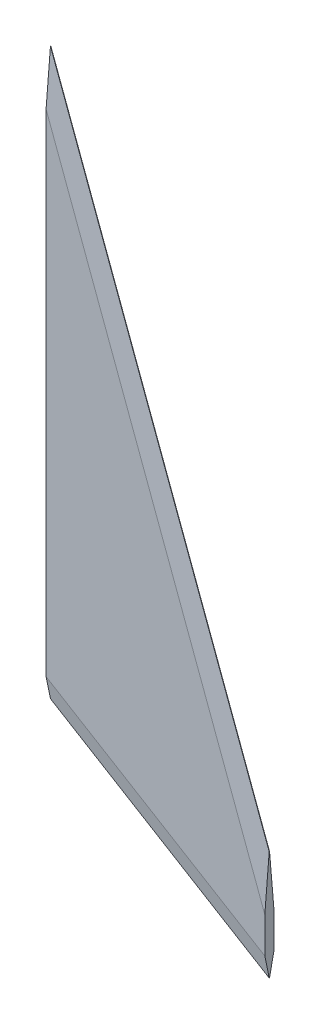
ISO-10303-21;
HEADER;
FILE_DESCRIPTION(('STEP AP214'),'2;1');
FILE_NAME('part.step','',(''),(''),'','','');
FILE_SCHEMA(('AUTOMOTIVE_DESIGN { 1 0 10303 214 1 1 1 1 }'));
ENDSEC;
DATA;
#1=APPLICATION_CONTEXT('core data for automotive mechanical design processes');
#2=APPLICATION_PROTOCOL_DEFINITION('international standard','automotive_design',2000,#1);
#3=PRODUCT_CONTEXT('',#1,'mechanical');
#4=PRODUCT('Part','Part','',(#3));
#5=PRODUCT_RELATED_PRODUCT_CATEGORY('part','',(#4));
#6=PRODUCT_DEFINITION_FORMATION('','',#4);
#7=PRODUCT_DEFINITION_CONTEXT('part definition',#1,'design');
#8=PRODUCT_DEFINITION('design','',#6,#7);
#9=PRODUCT_DEFINITION_SHAPE('','',#8);
#10=(LENGTH_UNIT() NAMED_UNIT(*) SI_UNIT(.MILLI.,.METRE.));
#11=(NAMED_UNIT(*) PLANE_ANGLE_UNIT() SI_UNIT($,.RADIAN.));
#12=(NAMED_UNIT(*) SI_UNIT($,.STERADIAN.) SOLID_ANGLE_UNIT());
#13=UNCERTAINTY_MEASURE_WITH_UNIT(LENGTH_MEASURE(1.E-05),#10,'distance_accuracy_value','');
#14=(GEOMETRIC_REPRESENTATION_CONTEXT(3) GLOBAL_UNCERTAINTY_ASSIGNED_CONTEXT((#13)) GLOBAL_UNIT_ASSIGNED_CONTEXT((#10,
#11,#12)) REPRESENTATION_CONTEXT('',''));
#15=CARTESIAN_POINT('',(0.,0.,0.));
#16=DIRECTION('',(0.,0.,1.));
#17=DIRECTION('',(1.,0.,0.));
#18=AXIS2_PLACEMENT_3D('',#15,#16,#17);
#19=CARTESIAN_POINT('',(152.414038873501,-92.3290000000001,6.35));
#20=DIRECTION('',(0.518124629895629,0.855305131456322,0.));
#21=DIRECTION('',(-0.855305131456322,0.518124629895629,0.));
#22=AXIS2_PLACEMENT_3D('',#19,#20,#21);
#23=PLANE('',#22);
#24=DIRECTION('',(0.,0.,-1.));
#25=VECTOR('',#24,1.);
#26=CARTESIAN_POINT('',(152.414038873501,-92.3290000000001,6.35));
#27=LINE('',#26,#25);
#28=CARTESIAN_POINT('',(152.414038873501,-92.3290000000001,3.30199999999997));
#29=VERTEX_POINT('',#28);
#30=CARTESIAN_POINT('',(152.414038873501,-92.3290000000001,3.04800000000002));
#31=VERTEX_POINT('',#30);
#32=EDGE_CURVE('E129',#29,#31,#27,.T.);
#33=ORIENTED_EDGE('',*,*,#32,.F.);
#34=DIRECTION('',(-0.855305131456322,0.518124629895629,0.));
#35=VECTOR('',#34,1.);
#36=CARTESIAN_POINT('',(152.414038873501,-92.3290000000001,3.30199999999997));
#37=LINE('',#36,#35);
#38=CARTESIAN_POINT('',(0.,0.,3.30199999999997));
#39=VERTEX_POINT('',#38);
#40=EDGE_CURVE('E78',#29,#39,#37,.T.);
#41=ORIENTED_EDGE('',*,*,#40,.T.);
#42=DIRECTION('',(0.,0.,-1.));
#43=VECTOR('',#42,1.);
#44=CARTESIAN_POINT('',(0.,0.,6.35));
#45=LINE('',#44,#43);
#46=CARTESIAN_POINT('',(0.,0.,3.04800000000002));
#47=VERTEX_POINT('',#46);
#48=EDGE_CURVE('E152',#39,#47,#45,.T.);
#49=ORIENTED_EDGE('',*,*,#48,.T.);
#50=DIRECTION('',(0.855305131456322,-0.518124629895629,0.));
#51=VECTOR('',#50,1.);
#52=CARTESIAN_POINT('',(152.414038873501,-92.3290000000001,3.04800000000002));
#53=LINE('',#52,#51);
#54=EDGE_CURVE('E139',#47,#31,#53,.T.);
#55=ORIENTED_EDGE('',*,*,#54,.T.);
#56=EDGE_LOOP('',(#33,#41,#49,#55));
#57=FACE_BOUND('',#56,.T.);
#58=ADVANCED_FACE('F48',(#57),#23,.F.);
#59=CARTESIAN_POINT('',(152.414038873501,-16.1290000000001,6.35));
#60=DIRECTION('',(-1.,0.,0.));
#61=DIRECTION('',(0.,-1.,0.));
#62=AXIS2_PLACEMENT_3D('',#59,#60,#61);
#63=PLANE('',#62);
#64=DIRECTION('',(0.,1.,0.));
#65=VECTOR('',#64,1.);
#66=CARTESIAN_POINT('',(152.414038873501,-16.1290000000001,6.35));
#67=LINE('',#66,#65);
#68=CARTESIAN_POINT('',(152.414038873501,-77.4804979474331,6.35));
#69=VERTEX_POINT('',#68);
#70=CARTESIAN_POINT('',(152.414038873501,-52.5633615547442,6.35));
#71=VERTEX_POINT('',#70);
#72=EDGE_CURVE('E205',#69,#71,#67,.T.);
#73=ORIENTED_EDGE('',*,*,#72,.F.);
#74=DIRECTION('',(0.,0.979574726464062,0.20108046964551));
#75=VECTOR('',#74,1.);
#76=CARTESIAN_POINT('',(152.414038873501,7.29037639493369,23.7511913175355));
#77=LINE('',#76,#75);
#78=EDGE_CURVE('E136',#69,#29,#77,.F.);
#79=ORIENTED_EDGE('',*,*,#78,.T.);
#80=ORIENTED_EDGE('',*,*,#32,.T.);
#81=DIRECTION('',(0.,0.979574726464062,-0.20108046964551));
#82=VECTOR('',#81,1.);
#83=CARTESIAN_POINT('',(152.414038873501,-92.3290000000001,3.04800000000002));
#84=LINE('',#83,#82);
#85=CARTESIAN_POINT('',(152.414038873501,-77.4804979474331,0.));
#86=VERTEX_POINT('',#85);
#87=EDGE_CURVE('E134',#31,#86,#84,.T.);
#88=ORIENTED_EDGE('',*,*,#87,.T.);
#89=DIRECTION('',(0.,1.,0.));
#90=VECTOR('',#89,1.);
#91=CARTESIAN_POINT('',(152.414038873501,-16.1290000000001,0.));
#92=LINE('',#91,#90);
#93=CARTESIAN_POINT('',(152.414038873501,-52.5633615547441,0.));
#94=VERTEX_POINT('',#93);
#95=EDGE_CURVE('E270',#86,#94,#92,.T.);
#96=ORIENTED_EDGE('',*,*,#95,.T.);
#97=DIRECTION('',(0.,0.996518989681084,0.0833660794627664));
#98=VECTOR('',#97,1.);
#99=CARTESIAN_POINT('',(152.414038873501,390.851728119401,37.0949053490638));
#100=LINE('',#99,#98);
#101=CARTESIAN_POINT('',(152.414038873501,-16.1290000000001,3.04800000000002));
#102=VERTEX_POINT('',#101);
#103=EDGE_CURVE('E150',#94,#102,#100,.T.);
#104=ORIENTED_EDGE('',*,*,#103,.T.);
#105=DIRECTION('',(0.,0.,-1.));
#106=VECTOR('',#105,1.);
#107=CARTESIAN_POINT('',(152.414038873501,-16.1290000000001,6.35));
#108=LINE('',#107,#106);
#109=CARTESIAN_POINT('',(152.414038873501,-16.1290000000001,3.30199999999997));
#110=VERTEX_POINT('',#109);
#111=EDGE_CURVE('E140',#110,#102,#108,.T.);
#112=ORIENTED_EDGE('',*,*,#111,.F.);
#113=DIRECTION('',(0.,0.996518989681084,-0.0833660794627664));
#114=VECTOR('',#113,1.);
#115=CARTESIAN_POINT('',(152.414038873501,42.7416620456271,-1.62296012714428));
#116=LINE('',#115,#114);
#117=EDGE_CURVE('E183',#110,#71,#116,.F.);
#118=ORIENTED_EDGE('',*,*,#117,.T.);
#119=EDGE_LOOP('',(#73,#79,#80,#88,#96,#104,#112,#118));
#120=FACE_BOUND('',#119,.T.);
#121=ADVANCED_FACE('F132',(#120),#63,.F.);
#122=CARTESIAN_POINT('',(0.,393.7,6.35));
#123=DIRECTION('',(-0.937281989491893,-0.34857204732181,0.));
#124=DIRECTION('',(0.34857204732181,-0.937281989491894,0.));
#125=AXIS2_PLACEMENT_3D('',#122,#123,#124);
#126=PLANE('',#125);
#127=DIRECTION('',(0.,0.,-1.));
#128=VECTOR('',#127,1.);
#129=CARTESIAN_POINT('',(0.,393.7,6.35));
#130=LINE('',#129,#128);
#131=CARTESIAN_POINT('',(0.,393.7,3.30199999999997));
#132=VERTEX_POINT('',#131);
#133=CARTESIAN_POINT('',(0.,393.7,3.04800000000002));
#134=VERTEX_POINT('',#133);
#135=EDGE_CURVE('E257',#132,#134,#130,.T.);
#136=ORIENTED_EDGE('',*,*,#135,.F.);
#137=DIRECTION('',(0.34857204732181,-0.937281989491894,0.));
#138=VECTOR('',#137,1.);
#139=CARTESIAN_POINT('',(0.,393.7,3.30199999999997));
#140=LINE('',#139,#138);
#141=EDGE_CURVE('E11',#132,#110,#140,.T.);
#142=ORIENTED_EDGE('',*,*,#141,.T.);
#143=ORIENTED_EDGE('',*,*,#111,.T.);
#144=DIRECTION('',(-0.34857204732181,0.937281989491894,0.));
#145=VECTOR('',#144,1.);
#146=CARTESIAN_POINT('',(0.,393.7,3.04800000000002));
#147=LINE('',#146,#145);
#148=EDGE_CURVE('E171',#102,#134,#147,.T.);
#149=ORIENTED_EDGE('',*,*,#148,.T.);
#150=EDGE_LOOP('',(#136,#142,#143,#149));
#151=FACE_BOUND('',#150,.T.);
#152=ADVANCED_FACE('F225',(#151),#126,.F.);
#153=CARTESIAN_POINT('',(0.,0.,6.35));
#154=DIRECTION('',(1.,0.,0.));
#155=DIRECTION('',(0.,0.,-1.));
#156=AXIS2_PLACEMENT_3D('',#153,#154,#155);
#157=PLANE('',#156);
#158=ORIENTED_EDGE('',*,*,#48,.F.);
#159=DIRECTION('',(0.,-0.979574726464062,-0.20108046964551));
#160=VECTOR('',#159,1.);
#161=CARTESIAN_POINT('',(0.,11.0235476539214,5.5648392500605));
#162=LINE('',#161,#160);
#163=CARTESIAN_POINT('',(0.,14.8485020525669,6.35));
#164=VERTEX_POINT('',#163);
#165=EDGE_CURVE('E58',#39,#164,#162,.F.);
#166=ORIENTED_EDGE('',*,*,#165,.T.);
#167=DIRECTION('',(0.,-1.,0.));
#168=VECTOR('',#167,1.);
#169=CARTESIAN_POINT('',(0.,0.,6.35));
#170=LINE('',#169,#168);
#171=CARTESIAN_POINT('',(0.,357.265638445256,6.35));
#172=VERTEX_POINT('',#171);
#173=EDGE_CURVE('E197',#172,#164,#170,.T.);
#174=ORIENTED_EDGE('',*,*,#173,.F.);
#175=DIRECTION('',(0.,-0.996518989681084,0.0833660794627665));
#176=VECTOR('',#175,1.);
#177=CARTESIAN_POINT('',(0.,45.5899339262258,32.4239452219196));
#178=LINE('',#177,#176);
#179=EDGE_CURVE('E67',#172,#132,#178,.F.);
#180=ORIENTED_EDGE('',*,*,#179,.T.);
#181=ORIENTED_EDGE('',*,*,#135,.T.);
#182=DIRECTION('',(0.,-0.996518989681084,-0.0833660794627665));
#183=VECTOR('',#182,1.);
#184=CARTESIAN_POINT('',(0.,393.7,3.04800000000002));
#185=LINE('',#184,#183);
#186=CARTESIAN_POINT('',(0.,357.265638445256,0.));
#187=VERTEX_POINT('',#186);
#188=EDGE_CURVE('E165',#134,#187,#185,.T.);
#189=ORIENTED_EDGE('',*,*,#188,.T.);
#190=DIRECTION('',(0.,-1.,0.));
#191=VECTOR('',#190,1.);
#192=CARTESIAN_POINT('',(0.,0.,0.));
#193=LINE('',#192,#191);
#194=CARTESIAN_POINT('',(0.,14.848502052567,0.));
#195=VERTEX_POINT('',#194);
#196=EDGE_CURVE('E265',#187,#195,#193,.T.);
#197=ORIENTED_EDGE('',*,*,#196,.T.);
#198=DIRECTION('',(0.,-0.979574726464062,0.20108046964551));
#199=VECTOR('',#198,1.);
#200=CARTESIAN_POINT('',(0.,-88.5958287410123,21.234352067475));
#201=LINE('',#200,#199);
#202=EDGE_CURVE('E168',#195,#47,#201,.T.);
#203=ORIENTED_EDGE('',*,*,#202,.T.);
#204=EDGE_LOOP('',(#158,#166,#174,#180,#181,#189,#197,#203));
#205=FACE_BOUND('',#204,.T.);
#206=ADVANCED_FACE('F196',(#205),#157,.F.);
#207=CARTESIAN_POINT('',(0.,0.,6.35));
#208=DIRECTION('',(0.,0.,-1.));
#209=DIRECTION('',(-1.,0.,0.));
#210=AXIS2_PLACEMENT_3D('',#207,#208,#209);
#211=PLANE('',#210);
#212=ORIENTED_EDGE('',*,*,#173,.T.);
#213=DIRECTION('',(0.855305131456323,-0.518124629895629,0.));
#214=VECTOR('',#213,1.);
#215=CARTESIAN_POINT('',(6.58018279967462,10.8623751694955,6.35));
#216=LINE('',#215,#214);
#217=EDGE_CURVE('E179',#164,#69,#216,.T.);
#218=ORIENTED_EDGE('',*,*,#217,.T.);
#219=ORIENTED_EDGE('',*,*,#72,.T.);
#220=DIRECTION('',(-0.34857204732181,0.937281989491894,0.));
#221=VECTOR('',#220,1.);
#222=CARTESIAN_POINT('',(116.722364628903,43.4086582939632,6.35));
#223=LINE('',#222,#221);
#224=EDGE_CURVE('E175',#71,#172,#223,.T.);
#225=ORIENTED_EDGE('',*,*,#224,.T.);
#226=EDGE_LOOP('',(#212,#218,#219,#225));
#227=FACE_BOUND('',#226,.T.);
#228=ADVANCED_FACE('F201',(#227),#211,.F.);
#229=CARTESIAN_POINT('',(0.,0.,0.));
#230=DIRECTION('',(0.,0.,-1.));
#231=DIRECTION('',(-1.,0.,0.));
#232=AXIS2_PLACEMENT_3D('',#229,#230,#231);
#233=PLANE('',#232);
#234=ORIENTED_EDGE('',*,*,#95,.F.);
#235=DIRECTION('',(-0.855305131456323,0.518124629895629,0.));
#236=VECTOR('',#235,1.);
#237=CARTESIAN_POINT('',(6.58018279967463,10.8623751694955,0.));
#238=LINE('',#237,#236);
#239=EDGE_CURVE('E147',#86,#195,#238,.T.);
#240=ORIENTED_EDGE('',*,*,#239,.T.);
#241=ORIENTED_EDGE('',*,*,#196,.F.);
#242=DIRECTION('',(0.34857204732181,-0.937281989491894,0.));
#243=VECTOR('',#242,1.);
#244=CARTESIAN_POINT('',(140.510557606954,-20.5558650009871,0.));
#245=LINE('',#244,#243);
#246=EDGE_CURVE('E149',#187,#94,#245,.T.);
#247=ORIENTED_EDGE('',*,*,#246,.T.);
#248=EDGE_LOOP('',(#234,#240,#241,#247));
#249=FACE_BOUND('',#248,.T.);
#250=ADVANCED_FACE('F234',(#249),#233,.T.);
#251=CARTESIAN_POINT('',(152.414038873501,-92.3290000000001,3.04800000000002));
#252=DIRECTION('',(-0.120916274628926,-0.199605083795255,-0.972387301980518));
#253=DIRECTION('',(-0.855305131456322,0.518124629895629,0.));
#254=AXIS2_PLACEMENT_3D('',#251,#252,#253);
#255=PLANE('',#254);
#256=ORIENTED_EDGE('',*,*,#202,.F.);
#257=ORIENTED_EDGE('',*,*,#239,.F.);
#258=ORIENTED_EDGE('',*,*,#87,.F.);
#259=ORIENTED_EDGE('',*,*,#54,.F.);
#260=EDGE_LOOP('',(#256,#257,#258,#259));
#261=FACE_BOUND('',#260,.T.);
#262=ADVANCED_FACE('F146',(#261),#255,.T.);
#263=CARTESIAN_POINT('',(0.,393.7,3.04800000000002));
#264=DIRECTION('',(0.218736265189667,0.0813472878338585,-0.972387301980518));
#265=DIRECTION('',(0.34857204732181,-0.937281989491894,0.));
#266=AXIS2_PLACEMENT_3D('',#263,#264,#265);
#267=PLANE('',#266);
#268=ORIENTED_EDGE('',*,*,#103,.F.);
#269=ORIENTED_EDGE('',*,*,#246,.F.);
#270=ORIENTED_EDGE('',*,*,#188,.F.);
#271=ORIENTED_EDGE('',*,*,#148,.F.);
#272=EDGE_LOOP('',(#268,#269,#270,#271));
#273=FACE_BOUND('',#272,.T.);
#274=ADVANCED_FACE('F209',(#273),#267,.T.);
#275=CARTESIAN_POINT('',(6.58018279967463,10.8623751694955,6.35));
#276=DIRECTION('',(0.120916274628926,0.199605083795255,-0.972387301980518));
#277=DIRECTION('',(0.855305131456322,-0.518124629895629,0.));
#278=AXIS2_PLACEMENT_3D('',#275,#276,#277);
#279=PLANE('',#278);
#280=ORIENTED_EDGE('',*,*,#165,.F.);
#281=ORIENTED_EDGE('',*,*,#40,.F.);
#282=ORIENTED_EDGE('',*,*,#78,.F.);
#283=ORIENTED_EDGE('',*,*,#217,.F.);
#284=EDGE_LOOP('',(#280,#281,#282,#283));
#285=FACE_BOUND('',#284,.T.);
#286=ADVANCED_FACE('F207',(#285),#279,.F.);
#287=CARTESIAN_POINT('',(116.722364628903,43.4086582939632,6.35));
#288=DIRECTION('',(-0.218736265189667,-0.0813472878338585,-0.972387301980518));
#289=DIRECTION('',(-0.34857204732181,0.937281989491894,0.));
#290=AXIS2_PLACEMENT_3D('',#287,#288,#289);
#291=PLANE('',#290);
#292=ORIENTED_EDGE('',*,*,#117,.F.);
#293=ORIENTED_EDGE('',*,*,#141,.F.);
#294=ORIENTED_EDGE('',*,*,#179,.F.);
#295=ORIENTED_EDGE('',*,*,#224,.F.);
#296=EDGE_LOOP('',(#292,#293,#294,#295));
#297=FACE_BOUND('',#296,.T.);
#298=ADVANCED_FACE('F51',(#297),#291,.F.);
#299=CLOSED_SHELL('',(#58,#121,#152,#206,#228,#250,#262,#274,#286,#298));
#300=MANIFOLD_SOLID_BREP('B2',#299);
#301=ADVANCED_BREP_SHAPE_REPRESENTATION('',(#18,#300),#14);
#302=SHAPE_DEFINITION_REPRESENTATION(#9,#301);
ENDSEC;
END-ISO-10303-21;
